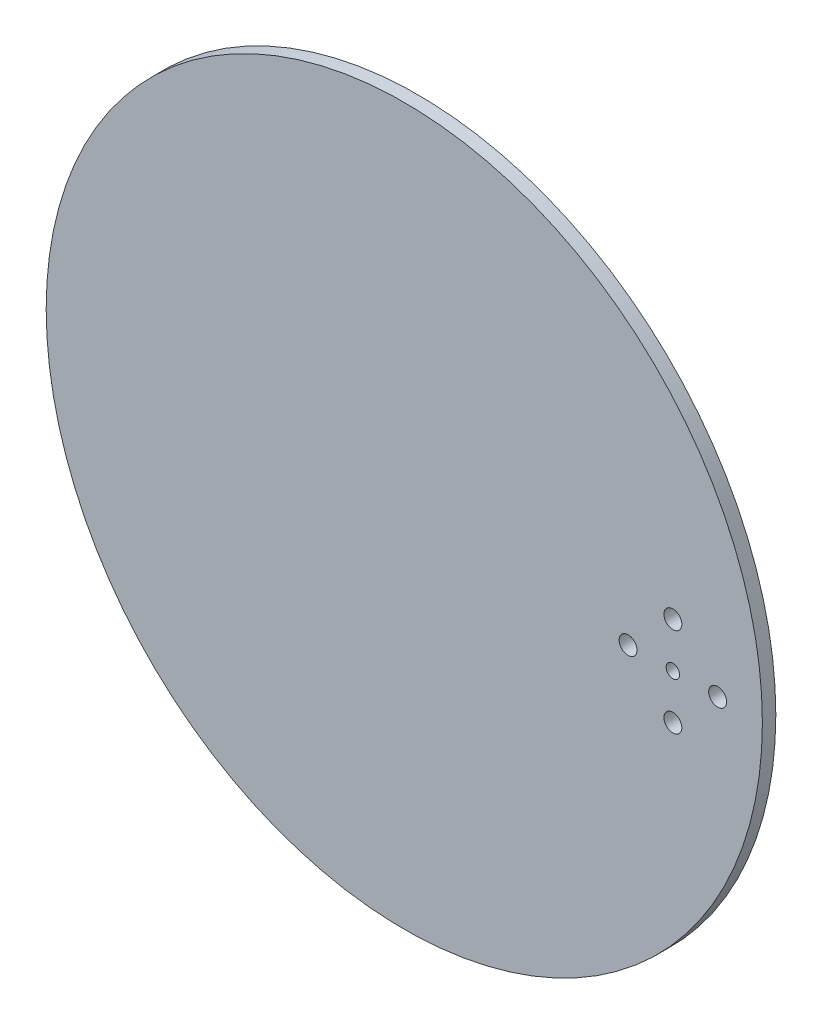
ISO-10303-21;
HEADER;
FILE_DESCRIPTION(('STEP AP214'),'2;1');
FILE_NAME('part.step','',(''),(''),'','','');
FILE_SCHEMA(('AUTOMOTIVE_DESIGN { 1 0 10303 214 1 1 1 1 }'));
ENDSEC;
DATA;
#1=APPLICATION_CONTEXT('core data for automotive mechanical design processes');
#2=APPLICATION_PROTOCOL_DEFINITION('international standard','automotive_design',2000,#1);
#3=PRODUCT_CONTEXT('',#1,'mechanical');
#4=PRODUCT('Part','Part','',(#3));
#5=PRODUCT_RELATED_PRODUCT_CATEGORY('part','',(#4));
#6=PRODUCT_DEFINITION_FORMATION('','',#4);
#7=PRODUCT_DEFINITION_CONTEXT('part definition',#1,'design');
#8=PRODUCT_DEFINITION('design','',#6,#7);
#9=PRODUCT_DEFINITION_SHAPE('','',#8);
#10=(LENGTH_UNIT() NAMED_UNIT(*) SI_UNIT(.MILLI.,.METRE.));
#11=(NAMED_UNIT(*) PLANE_ANGLE_UNIT() SI_UNIT($,.RADIAN.));
#12=(NAMED_UNIT(*) SI_UNIT($,.STERADIAN.) SOLID_ANGLE_UNIT());
#13=UNCERTAINTY_MEASURE_WITH_UNIT(LENGTH_MEASURE(1.E-05),#10,'distance_accuracy_value','');
#14=(GEOMETRIC_REPRESENTATION_CONTEXT(3) GLOBAL_UNCERTAINTY_ASSIGNED_CONTEXT((#13)) GLOBAL_UNIT_ASSIGNED_CONTEXT((#10,
#11,#12)) REPRESENTATION_CONTEXT('',''));
#15=CARTESIAN_POINT('',(0.,0.,0.));
#16=DIRECTION('',(0.,0.,1.));
#17=DIRECTION('',(1.,0.,0.));
#18=AXIS2_PLACEMENT_3D('',#15,#16,#17);
#19=CARTESIAN_POINT('',(0.,0.,3.));
#20=DIRECTION('',(0.,0.,-1.));
#21=DIRECTION('',(-1.,0.,0.));
#22=AXIS2_PLACEMENT_3D('',#19,#20,#21);
#23=CYLINDRICAL_SURFACE('',#22,80.);
#24=CARTESIAN_POINT('',(0.,0.,3.));
#25=DIRECTION('',(0.,0.,1.));
#26=DIRECTION('',(1.,0.,0.));
#27=AXIS2_PLACEMENT_3D('',#24,#25,#26);
#28=CIRCLE('',#27,80.);
#29=CARTESIAN_POINT('',(80.,0.,3.));
#30=VERTEX_POINT('',#29);
#31=EDGE_CURVE('E10',#30,#30,#28,.T.);
#32=ORIENTED_EDGE('',*,*,#31,.F.);
#33=EDGE_LOOP('',(#32));
#34=FACE_BOUND('',#33,.T.);
#35=CARTESIAN_POINT('',(0.,0.,0.));
#36=DIRECTION('',(0.,0.,1.));
#37=DIRECTION('',(1.,0.,0.));
#38=AXIS2_PLACEMENT_3D('',#35,#36,#37);
#39=CIRCLE('',#38,80.);
#40=CARTESIAN_POINT('',(80.,0.,0.));
#41=VERTEX_POINT('',#40);
#42=EDGE_CURVE('E34',#41,#41,#39,.T.);
#43=ORIENTED_EDGE('',*,*,#42,.T.);
#44=EDGE_LOOP('',(#43));
#45=FACE_BOUND('',#44,.T.);
#46=ADVANCED_FACE('F31',(#34,#45),#23,.T.);
#47=CARTESIAN_POINT('',(0.,0.,3.));
#48=DIRECTION('',(0.,0.,1.));
#49=DIRECTION('',(1.,0.,0.));
#50=AXIS2_PLACEMENT_3D('',#47,#48,#49);
#51=PLANE('',#50);
#52=CARTESIAN_POINT('',(70.,0.,3.));
#53=DIRECTION('',(0.,0.,1.));
#54=DIRECTION('',(1.,0.,0.));
#55=AXIS2_PLACEMENT_3D('',#52,#53,#54);
#56=CIRCLE('',#55,2.);
#57=CARTESIAN_POINT('',(72.,0.,3.));
#58=VERTEX_POINT('',#57);
#59=EDGE_CURVE('E56',#58,#58,#56,.T.);
#60=ORIENTED_EDGE('',*,*,#59,.F.);
#61=EDGE_LOOP('',(#60));
#62=FACE_BOUND('',#61,.T.);
#63=CARTESIAN_POINT('',(60.,9.99999999999999,3.));
#64=DIRECTION('',(0.,0.,1.));
#65=DIRECTION('',(1.,0.,0.));
#66=AXIS2_PLACEMENT_3D('',#63,#64,#65);
#67=CIRCLE('',#66,2.);
#68=CARTESIAN_POINT('',(62.,9.99999999999999,3.));
#69=VERTEX_POINT('',#68);
#70=EDGE_CURVE('E57',#69,#69,#67,.T.);
#71=ORIENTED_EDGE('',*,*,#70,.F.);
#72=EDGE_LOOP('',(#71));
#73=FACE_BOUND('',#72,.T.);
#74=CARTESIAN_POINT('',(50.,0.,3.));
#75=DIRECTION('',(0.,0.,1.));
#76=DIRECTION('',(1.,0.,0.));
#77=AXIS2_PLACEMENT_3D('',#74,#75,#76);
#78=CIRCLE('',#77,2.);
#79=CARTESIAN_POINT('',(52.,0.,3.));
#80=VERTEX_POINT('',#79);
#81=EDGE_CURVE('E63',#80,#80,#78,.T.);
#82=ORIENTED_EDGE('',*,*,#81,.F.);
#83=EDGE_LOOP('',(#82));
#84=FACE_BOUND('',#83,.T.);
#85=CARTESIAN_POINT('',(60.,0.,3.));
#86=DIRECTION('',(0.,0.,1.));
#87=DIRECTION('',(1.,0.,0.));
#88=AXIS2_PLACEMENT_3D('',#85,#86,#87);
#89=CIRCLE('',#88,1.5);
#90=CARTESIAN_POINT('',(61.5,0.,3.));
#91=VERTEX_POINT('',#90);
#92=EDGE_CURVE('E43',#91,#91,#89,.T.);
#93=ORIENTED_EDGE('',*,*,#92,.F.);
#94=EDGE_LOOP('',(#93));
#95=FACE_BOUND('',#94,.T.);
#96=CARTESIAN_POINT('',(60.,-9.99999999999999,3.));
#97=DIRECTION('',(0.,0.,1.));
#98=DIRECTION('',(1.,0.,0.));
#99=AXIS2_PLACEMENT_3D('',#96,#97,#98);
#100=CIRCLE('',#99,2.);
#101=CARTESIAN_POINT('',(62.,-9.99999999999999,3.));
#102=VERTEX_POINT('',#101);
#103=EDGE_CURVE('E50',#102,#102,#100,.T.);
#104=ORIENTED_EDGE('',*,*,#103,.F.);
#105=EDGE_LOOP('',(#104));
#106=FACE_BOUND('',#105,.T.);
#107=ORIENTED_EDGE('',*,*,#31,.T.);
#108=EDGE_LOOP('',(#107));
#109=FACE_BOUND('',#108,.T.);
#110=ADVANCED_FACE('F83',(#62,#73,#84,#95,#106,#109),#51,.T.);
#111=CARTESIAN_POINT('',(0.,0.,0.));
#112=DIRECTION('',(0.,0.,1.));
#113=DIRECTION('',(1.,0.,0.));
#114=AXIS2_PLACEMENT_3D('',#111,#112,#113);
#115=PLANE('',#114);
#116=CARTESIAN_POINT('',(70.,0.,0.));
#117=DIRECTION('',(0.,0.,1.));
#118=DIRECTION('',(1.,0.,0.));
#119=AXIS2_PLACEMENT_3D('',#116,#117,#118);
#120=CIRCLE('',#119,2.);
#121=CARTESIAN_POINT('',(72.,0.,0.));
#122=VERTEX_POINT('',#121);
#123=EDGE_CURVE('E41',#122,#122,#120,.T.);
#124=ORIENTED_EDGE('',*,*,#123,.T.);
#125=EDGE_LOOP('',(#124));
#126=FACE_BOUND('',#125,.T.);
#127=CARTESIAN_POINT('',(60.,9.99999999999999,0.));
#128=DIRECTION('',(0.,0.,1.));
#129=DIRECTION('',(1.,0.,0.));
#130=AXIS2_PLACEMENT_3D('',#127,#128,#129);
#131=CIRCLE('',#130,2.);
#132=CARTESIAN_POINT('',(62.,9.99999999999999,0.));
#133=VERTEX_POINT('',#132);
#134=EDGE_CURVE('E60',#133,#133,#131,.T.);
#135=ORIENTED_EDGE('',*,*,#134,.T.);
#136=EDGE_LOOP('',(#135));
#137=FACE_BOUND('',#136,.T.);
#138=CARTESIAN_POINT('',(50.,0.,0.));
#139=DIRECTION('',(0.,0.,1.));
#140=DIRECTION('',(1.,0.,0.));
#141=AXIS2_PLACEMENT_3D('',#138,#139,#140);
#142=CIRCLE('',#141,2.);
#143=CARTESIAN_POINT('',(52.,0.,0.));
#144=VERTEX_POINT('',#143);
#145=EDGE_CURVE('E47',#144,#144,#142,.T.);
#146=ORIENTED_EDGE('',*,*,#145,.T.);
#147=EDGE_LOOP('',(#146));
#148=FACE_BOUND('',#147,.T.);
#149=CARTESIAN_POINT('',(60.,0.,0.));
#150=DIRECTION('',(0.,0.,1.));
#151=DIRECTION('',(1.,0.,0.));
#152=AXIS2_PLACEMENT_3D('',#149,#150,#151);
#153=CIRCLE('',#152,1.5);
#154=CARTESIAN_POINT('',(61.5,0.,0.));
#155=VERTEX_POINT('',#154);
#156=EDGE_CURVE('E46',#155,#155,#153,.T.);
#157=ORIENTED_EDGE('',*,*,#156,.T.);
#158=EDGE_LOOP('',(#157));
#159=FACE_BOUND('',#158,.T.);
#160=CARTESIAN_POINT('',(60.,-9.99999999999999,0.));
#161=DIRECTION('',(0.,0.,1.));
#162=DIRECTION('',(1.,0.,0.));
#163=AXIS2_PLACEMENT_3D('',#160,#161,#162);
#164=CIRCLE('',#163,2.);
#165=CARTESIAN_POINT('',(62.,-9.99999999999999,0.));
#166=VERTEX_POINT('',#165);
#167=EDGE_CURVE('E53',#166,#166,#164,.T.);
#168=ORIENTED_EDGE('',*,*,#167,.T.);
#169=EDGE_LOOP('',(#168));
#170=FACE_BOUND('',#169,.T.);
#171=ORIENTED_EDGE('',*,*,#42,.F.);
#172=EDGE_LOOP('',(#171));
#173=FACE_BOUND('',#172,.T.);
#174=ADVANCED_FACE('F73',(#126,#137,#148,#159,#170,#173),#115,.F.);
#175=CARTESIAN_POINT('',(60.,-9.99999999999999,0.));
#176=DIRECTION('',(0.,0.,1.));
#177=DIRECTION('',(1.,0.,0.));
#178=AXIS2_PLACEMENT_3D('',#175,#176,#177);
#179=CYLINDRICAL_SURFACE('',#178,2.);
#180=ORIENTED_EDGE('',*,*,#167,.F.);
#181=EDGE_LOOP('',(#180));
#182=FACE_BOUND('',#181,.T.);
#183=ORIENTED_EDGE('',*,*,#103,.T.);
#184=EDGE_LOOP('',(#183));
#185=FACE_BOUND('',#184,.T.);
#186=ADVANCED_FACE('F95',(#182,#185),#179,.F.);
#187=CARTESIAN_POINT('',(60.,0.,0.));
#188=DIRECTION('',(0.,0.,1.));
#189=DIRECTION('',(1.,0.,0.));
#190=AXIS2_PLACEMENT_3D('',#187,#188,#189);
#191=CYLINDRICAL_SURFACE('',#190,1.5);
#192=ORIENTED_EDGE('',*,*,#156,.F.);
#193=EDGE_LOOP('',(#192));
#194=FACE_BOUND('',#193,.T.);
#195=ORIENTED_EDGE('',*,*,#92,.T.);
#196=EDGE_LOOP('',(#195));
#197=FACE_BOUND('',#196,.T.);
#198=ADVANCED_FACE('F97',(#194,#197),#191,.F.);
#199=CARTESIAN_POINT('',(50.,0.,0.));
#200=DIRECTION('',(0.,0.,1.));
#201=DIRECTION('',(1.,0.,0.));
#202=AXIS2_PLACEMENT_3D('',#199,#200,#201);
#203=CYLINDRICAL_SURFACE('',#202,2.);
#204=ORIENTED_EDGE('',*,*,#145,.F.);
#205=EDGE_LOOP('',(#204));
#206=FACE_BOUND('',#205,.T.);
#207=ORIENTED_EDGE('',*,*,#81,.T.);
#208=EDGE_LOOP('',(#207));
#209=FACE_BOUND('',#208,.T.);
#210=ADVANCED_FACE('F104',(#206,#209),#203,.F.);
#211=CARTESIAN_POINT('',(60.,9.99999999999999,0.));
#212=DIRECTION('',(0.,0.,1.));
#213=DIRECTION('',(1.,0.,0.));
#214=AXIS2_PLACEMENT_3D('',#211,#212,#213);
#215=CYLINDRICAL_SURFACE('',#214,2.);
#216=ORIENTED_EDGE('',*,*,#134,.F.);
#217=EDGE_LOOP('',(#216));
#218=FACE_BOUND('',#217,.T.);
#219=ORIENTED_EDGE('',*,*,#70,.T.);
#220=EDGE_LOOP('',(#219));
#221=FACE_BOUND('',#220,.T.);
#222=ADVANCED_FACE('F79',(#218,#221),#215,.F.);
#223=CARTESIAN_POINT('',(70.,0.,0.));
#224=DIRECTION('',(0.,0.,1.));
#225=DIRECTION('',(1.,0.,0.));
#226=AXIS2_PLACEMENT_3D('',#223,#224,#225);
#227=CYLINDRICAL_SURFACE('',#226,2.);
#228=ORIENTED_EDGE('',*,*,#123,.F.);
#229=EDGE_LOOP('',(#228));
#230=FACE_BOUND('',#229,.T.);
#231=ORIENTED_EDGE('',*,*,#59,.T.);
#232=EDGE_LOOP('',(#231));
#233=FACE_BOUND('',#232,.T.);
#234=ADVANCED_FACE('F76',(#230,#233),#227,.F.);
#235=CLOSED_SHELL('',(#46,#110,#174,#186,#198,#210,#222,#234));
#236=MANIFOLD_SOLID_BREP('B2',#235);
#237=ADVANCED_BREP_SHAPE_REPRESENTATION('',(#18,#236),#14);
#238=SHAPE_DEFINITION_REPRESENTATION(#9,#237);
ENDSEC;
END-ISO-10303-21;
